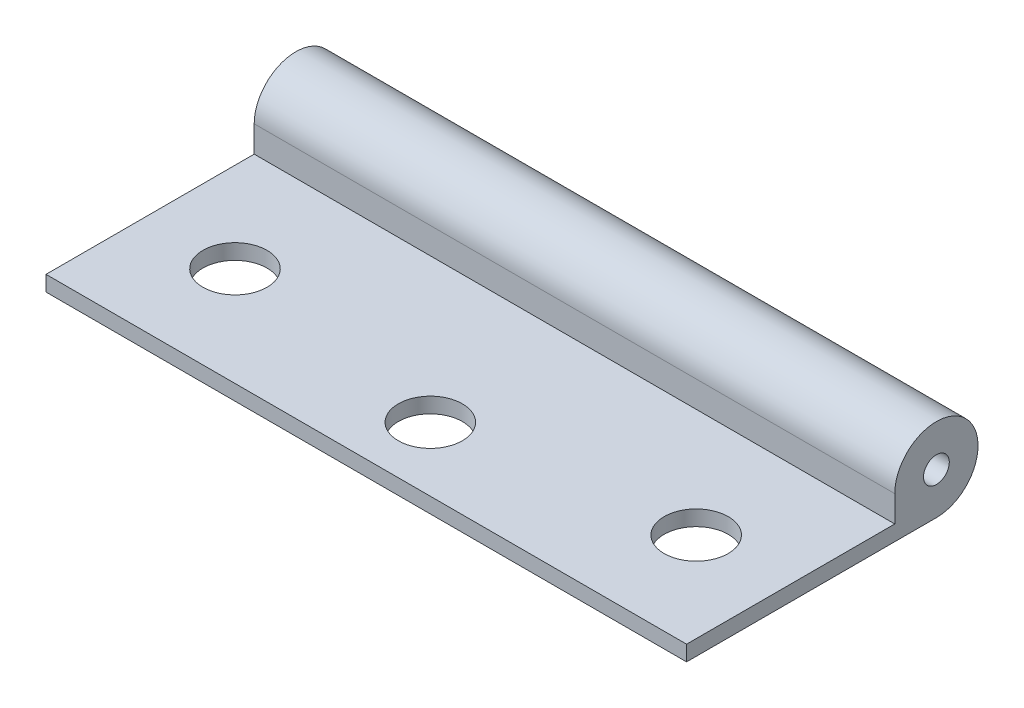
ISO-10303-21;
HEADER;
FILE_DESCRIPTION(('STEP AP214'),'2;1');
FILE_NAME('part.step','',(''),(''),'','','');
FILE_SCHEMA(('AUTOMOTIVE_DESIGN { 1 0 10303 214 1 1 1 1 }'));
ENDSEC;
DATA;
#1=APPLICATION_CONTEXT('core data for automotive mechanical design processes');
#2=APPLICATION_PROTOCOL_DEFINITION('international standard','automotive_design',2000,#1);
#3=PRODUCT_CONTEXT('',#1,'mechanical');
#4=PRODUCT('Part','Part','',(#3));
#5=PRODUCT_RELATED_PRODUCT_CATEGORY('part','',(#4));
#6=PRODUCT_DEFINITION_FORMATION('','',#4);
#7=PRODUCT_DEFINITION_CONTEXT('part definition',#1,'design');
#8=PRODUCT_DEFINITION('design','',#6,#7);
#9=PRODUCT_DEFINITION_SHAPE('','',#8);
#10=(LENGTH_UNIT() NAMED_UNIT(*) SI_UNIT(.MILLI.,.METRE.));
#11=(NAMED_UNIT(*) PLANE_ANGLE_UNIT() SI_UNIT($,.RADIAN.));
#12=(NAMED_UNIT(*) SI_UNIT($,.STERADIAN.) SOLID_ANGLE_UNIT());
#13=UNCERTAINTY_MEASURE_WITH_UNIT(LENGTH_MEASURE(1.E-05),#10,'distance_accuracy_value','');
#14=(GEOMETRIC_REPRESENTATION_CONTEXT(3) GLOBAL_UNCERTAINTY_ASSIGNED_CONTEXT((#13)) GLOBAL_UNIT_ASSIGNED_CONTEXT((#10,
#11,#12)) REPRESENTATION_CONTEXT('',''));
#15=CARTESIAN_POINT('',(0.,0.,0.));
#16=DIRECTION('',(0.,0.,1.));
#17=DIRECTION('',(1.,0.,0.));
#18=AXIS2_PLACEMENT_3D('',#15,#16,#17);
#19=CARTESIAN_POINT('',(0.,1.2,0.));
#20=DIRECTION('',(0.,1.,0.));
#21=DIRECTION('',(0.,0.,1.));
#22=AXIS2_PLACEMENT_3D('',#19,#20,#21);
#23=PLANE('',#22);
#24=CARTESIAN_POINT('',(43.,1.2,8.49999999999999));
#25=DIRECTION('',(0.,1.,0.));
#26=DIRECTION('',(0.,0.,1.));
#27=AXIS2_PLACEMENT_3D('',#24,#25,#26);
#28=CIRCLE('',#27,2.5);
#29=CARTESIAN_POINT('',(43.,1.2,11.));
#30=VERTEX_POINT('',#29);
#31=EDGE_CURVE('E109',#30,#30,#28,.T.);
#32=ORIENTED_EDGE('',*,*,#31,.F.);
#33=EDGE_LOOP('',(#32));
#34=FACE_BOUND('',#33,.T.);
#35=DIRECTION('',(0.,0.,1.));
#36=VECTOR('',#35,1.);
#37=CARTESIAN_POINT('',(0.,1.2,0.));
#38=LINE('',#37,#36);
#39=CARTESIAN_POINT('',(0.,1.2,0.));
#40=VERTEX_POINT('',#39);
#41=CARTESIAN_POINT('',(0.,1.2,16.25));
#42=VERTEX_POINT('',#41);
#43=EDGE_CURVE('E86',#40,#42,#38,.T.);
#44=ORIENTED_EDGE('',*,*,#43,.T.);
#45=DIRECTION('',(1.,0.,0.));
#46=VECTOR('',#45,1.);
#47=CARTESIAN_POINT('',(0.,1.2,16.25));
#48=LINE('',#47,#46);
#49=CARTESIAN_POINT('',(50.,1.2,16.25));
#50=VERTEX_POINT('',#49);
#51=EDGE_CURVE('E81',#42,#50,#48,.T.);
#52=ORIENTED_EDGE('',*,*,#51,.T.);
#53=DIRECTION('',(0.,0.,-1.));
#54=VECTOR('',#53,1.);
#55=CARTESIAN_POINT('',(50.,1.2,0.));
#56=LINE('',#55,#54);
#57=CARTESIAN_POINT('',(50.,1.2,0.));
#58=VERTEX_POINT('',#57);
#59=EDGE_CURVE('E85',#50,#58,#56,.T.);
#60=ORIENTED_EDGE('',*,*,#59,.T.);
#61=DIRECTION('',(-1.,0.,0.));
#62=VECTOR('',#61,1.);
#63=CARTESIAN_POINT('',(0.,1.2,0.));
#64=LINE('',#63,#62);
#65=EDGE_CURVE('E51',#58,#40,#64,.T.);
#66=ORIENTED_EDGE('',*,*,#65,.T.);
#67=EDGE_LOOP('',(#44,#52,#60,#66));
#68=FACE_BOUND('',#67,.T.);
#69=CARTESIAN_POINT('',(7.,1.2,8.5));
#70=DIRECTION('',(0.,1.,0.));
#71=DIRECTION('',(0.,0.,1.));
#72=AXIS2_PLACEMENT_3D('',#69,#70,#71);
#73=CIRCLE('',#72,2.5);
#74=CARTESIAN_POINT('',(7.,1.2,11.));
#75=VERTEX_POINT('',#74);
#76=EDGE_CURVE('E102',#75,#75,#73,.T.);
#77=ORIENTED_EDGE('',*,*,#76,.F.);
#78=EDGE_LOOP('',(#77));
#79=FACE_BOUND('',#78,.T.);
#80=CARTESIAN_POINT('',(25.,1.2,11.25));
#81=DIRECTION('',(0.,1.,0.));
#82=DIRECTION('',(0.,0.,1.));
#83=AXIS2_PLACEMENT_3D('',#80,#81,#82);
#84=CIRCLE('',#83,2.5);
#85=CARTESIAN_POINT('',(25.,1.2,13.75));
#86=VERTEX_POINT('',#85);
#87=EDGE_CURVE('E115',#86,#86,#84,.T.);
#88=ORIENTED_EDGE('',*,*,#87,.F.);
#89=EDGE_LOOP('',(#88));
#90=FACE_BOUND('',#89,.T.);
#91=ADVANCED_FACE('F34',(#34,#68,#79,#90),#23,.T.);
#92=CARTESIAN_POINT('',(0.,0.,0.));
#93=DIRECTION('',(0.,1.,0.));
#94=DIRECTION('',(0.,0.,1.));
#95=AXIS2_PLACEMENT_3D('',#92,#93,#94);
#96=PLANE('',#95);
#97=DIRECTION('',(0.,0.,1.));
#98=VECTOR('',#97,1.);
#99=CARTESIAN_POINT('',(0.,0.,0.));
#100=LINE('',#99,#98);
#101=CARTESIAN_POINT('',(0.,0.,-3.25));
#102=VERTEX_POINT('',#101);
#103=CARTESIAN_POINT('',(0.,0.,16.25));
#104=VERTEX_POINT('',#103);
#105=EDGE_CURVE('E99',#102,#104,#100,.T.);
#106=ORIENTED_EDGE('',*,*,#105,.F.);
#107=DIRECTION('',(-1.,0.,0.));
#108=VECTOR('',#107,1.);
#109=CARTESIAN_POINT('',(59.1923881554251,0.,-3.25000000000001));
#110=LINE('',#109,#108);
#111=CARTESIAN_POINT('',(50.,0.,-3.25000000000001));
#112=VERTEX_POINT('',#111);
#113=EDGE_CURVE('E126',#112,#102,#110,.T.);
#114=ORIENTED_EDGE('',*,*,#113,.F.);
#115=DIRECTION('',(0.,0.,-1.));
#116=VECTOR('',#115,1.);
#117=CARTESIAN_POINT('',(50.,0.,0.));
#118=LINE('',#117,#116);
#119=CARTESIAN_POINT('',(50.,0.,16.25));
#120=VERTEX_POINT('',#119);
#121=EDGE_CURVE('E104',#120,#112,#118,.T.);
#122=ORIENTED_EDGE('',*,*,#121,.F.);
#123=DIRECTION('',(1.,0.,0.));
#124=VECTOR('',#123,1.);
#125=CARTESIAN_POINT('',(0.,0.,16.25));
#126=LINE('',#125,#124);
#127=EDGE_CURVE('E63',#104,#120,#126,.T.);
#128=ORIENTED_EDGE('',*,*,#127,.F.);
#129=EDGE_LOOP('',(#106,#114,#122,#128));
#130=FACE_BOUND('',#129,.T.);
#131=CARTESIAN_POINT('',(7.,0.,8.5));
#132=DIRECTION('',(0.,1.,0.));
#133=DIRECTION('',(0.,0.,1.));
#134=AXIS2_PLACEMENT_3D('',#131,#132,#133);
#135=CIRCLE('',#134,2.5);
#136=CARTESIAN_POINT('',(7.,0.,11.));
#137=VERTEX_POINT('',#136);
#138=EDGE_CURVE('E106',#137,#137,#135,.T.);
#139=ORIENTED_EDGE('',*,*,#138,.T.);
#140=EDGE_LOOP('',(#139));
#141=FACE_BOUND('',#140,.T.);
#142=CARTESIAN_POINT('',(43.,0.,8.49999999999999));
#143=DIRECTION('',(0.,1.,0.));
#144=DIRECTION('',(0.,0.,1.));
#145=AXIS2_PLACEMENT_3D('',#142,#143,#144);
#146=CIRCLE('',#145,2.5);
#147=CARTESIAN_POINT('',(43.,0.,11.));
#148=VERTEX_POINT('',#147);
#149=EDGE_CURVE('E112',#148,#148,#146,.T.);
#150=ORIENTED_EDGE('',*,*,#149,.T.);
#151=EDGE_LOOP('',(#150));
#152=FACE_BOUND('',#151,.T.);
#153=CARTESIAN_POINT('',(25.,0.,11.25));
#154=DIRECTION('',(0.,1.,0.));
#155=DIRECTION('',(0.,0.,1.));
#156=AXIS2_PLACEMENT_3D('',#153,#154,#155);
#157=CIRCLE('',#156,2.5);
#158=CARTESIAN_POINT('',(25.,0.,13.75));
#159=VERTEX_POINT('',#158);
#160=EDGE_CURVE('E118',#159,#159,#157,.T.);
#161=ORIENTED_EDGE('',*,*,#160,.T.);
#162=EDGE_LOOP('',(#161));
#163=FACE_BOUND('',#162,.T.);
#164=ADVANCED_FACE('F147',(#130,#141,#152,#163),#96,.F.);
#165=CARTESIAN_POINT('',(0.,1.2,0.));
#166=DIRECTION('',(1.,0.,0.));
#167=DIRECTION('',(0.,0.,-1.));
#168=AXIS2_PLACEMENT_3D('',#165,#166,#167);
#169=PLANE('',#168);
#170=ORIENTED_EDGE('',*,*,#105,.T.);
#171=DIRECTION('',(0.,-1.,0.));
#172=VECTOR('',#171,1.);
#173=CARTESIAN_POINT('',(0.,1.2,16.25));
#174=LINE('',#173,#172);
#175=EDGE_CURVE('E11',#42,#104,#174,.T.);
#176=ORIENTED_EDGE('',*,*,#175,.F.);
#177=ORIENTED_EDGE('',*,*,#43,.F.);
#178=DIRECTION('',(0.,1.,0.));
#179=VECTOR('',#178,1.);
#180=CARTESIAN_POINT('',(0.,0.,0.));
#181=LINE('',#180,#179);
#182=CARTESIAN_POINT('',(0.,3.25,0.));
#183=VERTEX_POINT('',#182);
#184=EDGE_CURVE('E130',#40,#183,#181,.T.);
#185=ORIENTED_EDGE('',*,*,#184,.T.);
#186=CARTESIAN_POINT('',(0.,3.25,-3.25));
#187=DIRECTION('',(-1.,0.,0.));
#188=DIRECTION('',(0.,0.,1.));
#189=AXIS2_PLACEMENT_3D('',#186,#187,#188);
#190=CIRCLE('',#189,3.25);
#191=EDGE_CURVE('E135',#183,#102,#190,.T.);
#192=ORIENTED_EDGE('',*,*,#191,.T.);
#193=EDGE_LOOP('',(#170,#176,#177,#185,#192));
#194=FACE_BOUND('',#193,.T.);
#195=CARTESIAN_POINT('',(0.,3.25,-3.25));
#196=DIRECTION('',(-1.,0.,0.));
#197=DIRECTION('',(0.,0.,1.));
#198=AXIS2_PLACEMENT_3D('',#195,#196,#197);
#199=CIRCLE('',#198,1.00565376597662);
#200=CARTESIAN_POINT('',(0.,3.25,-2.24434623402338));
#201=VERTEX_POINT('',#200);
#202=EDGE_CURVE('E138',#201,#201,#199,.T.);
#203=ORIENTED_EDGE('',*,*,#202,.F.);
#204=EDGE_LOOP('',(#203));
#205=FACE_BOUND('',#204,.T.);
#206=ADVANCED_FACE('F36',(#194,#205),#169,.F.);
#207=CARTESIAN_POINT('',(0.,1.2,16.25));
#208=DIRECTION('',(0.,0.,-1.));
#209=DIRECTION('',(-1.,0.,0.));
#210=AXIS2_PLACEMENT_3D('',#207,#208,#209);
#211=PLANE('',#210);
#212=ORIENTED_EDGE('',*,*,#127,.T.);
#213=DIRECTION('',(0.,-1.,0.));
#214=VECTOR('',#213,1.);
#215=CARTESIAN_POINT('',(50.,1.2,16.25));
#216=LINE('',#215,#214);
#217=EDGE_CURVE('E43',#50,#120,#216,.T.);
#218=ORIENTED_EDGE('',*,*,#217,.F.);
#219=ORIENTED_EDGE('',*,*,#51,.F.);
#220=ORIENTED_EDGE('',*,*,#175,.T.);
#221=EDGE_LOOP('',(#212,#218,#219,#220));
#222=FACE_BOUND('',#221,.T.);
#223=ADVANCED_FACE('F91',(#222),#211,.F.);
#224=CARTESIAN_POINT('',(50.,1.2,0.));
#225=DIRECTION('',(-1.,0.,0.));
#226=DIRECTION('',(0.,0.,1.));
#227=AXIS2_PLACEMENT_3D('',#224,#225,#226);
#228=PLANE('',#227);
#229=ORIENTED_EDGE('',*,*,#121,.T.);
#230=CARTESIAN_POINT('',(50.,3.25,-3.25000000000001));
#231=DIRECTION('',(-1.,0.,0.));
#232=DIRECTION('',(0.,0.,1.));
#233=AXIS2_PLACEMENT_3D('',#230,#231,#232);
#234=CIRCLE('',#233,3.25);
#235=CARTESIAN_POINT('',(50.,3.25,0.));
#236=VERTEX_POINT('',#235);
#237=EDGE_CURVE('E72',#112,#236,#234,.F.);
#238=ORIENTED_EDGE('',*,*,#237,.T.);
#239=DIRECTION('',(0.,-1.,0.));
#240=VECTOR('',#239,1.);
#241=CARTESIAN_POINT('',(50.,0.,0.));
#242=LINE('',#241,#240);
#243=EDGE_CURVE('E94',#236,#58,#242,.T.);
#244=ORIENTED_EDGE('',*,*,#243,.T.);
#245=ORIENTED_EDGE('',*,*,#59,.F.);
#246=ORIENTED_EDGE('',*,*,#217,.T.);
#247=EDGE_LOOP('',(#229,#238,#244,#245,#246));
#248=FACE_BOUND('',#247,.T.);
#249=CARTESIAN_POINT('',(50.,3.25,-3.25000000000001));
#250=DIRECTION('',(-1.,0.,0.));
#251=DIRECTION('',(0.,0.,1.));
#252=AXIS2_PLACEMENT_3D('',#249,#250,#251);
#253=CIRCLE('',#252,1.00565376597662);
#254=CARTESIAN_POINT('',(50.,3.25,-2.24434623402338));
#255=VERTEX_POINT('',#254);
#256=EDGE_CURVE('E121',#255,#255,#253,.F.);
#257=ORIENTED_EDGE('',*,*,#256,.F.);
#258=EDGE_LOOP('',(#257));
#259=FACE_BOUND('',#258,.T.);
#260=ADVANCED_FACE('F92',(#248,#259),#228,.F.);
#261=CARTESIAN_POINT('',(7.,1.2,8.5));
#262=DIRECTION('',(0.,-1.,0.));
#263=DIRECTION('',(0.,0.,-1.));
#264=AXIS2_PLACEMENT_3D('',#261,#262,#263);
#265=CYLINDRICAL_SURFACE('',#264,2.5);
#266=ORIENTED_EDGE('',*,*,#76,.T.);
#267=EDGE_LOOP('',(#266));
#268=FACE_BOUND('',#267,.T.);
#269=ORIENTED_EDGE('',*,*,#138,.F.);
#270=EDGE_LOOP('',(#269));
#271=FACE_BOUND('',#270,.T.);
#272=ADVANCED_FACE('F161',(#268,#271),#265,.F.);
#273=CARTESIAN_POINT('',(43.,1.2,8.49999999999999));
#274=DIRECTION('',(0.,-1.,0.));
#275=DIRECTION('',(0.,0.,-1.));
#276=AXIS2_PLACEMENT_3D('',#273,#274,#275);
#277=CYLINDRICAL_SURFACE('',#276,2.5);
#278=ORIENTED_EDGE('',*,*,#31,.T.);
#279=EDGE_LOOP('',(#278));
#280=FACE_BOUND('',#279,.T.);
#281=ORIENTED_EDGE('',*,*,#149,.F.);
#282=EDGE_LOOP('',(#281));
#283=FACE_BOUND('',#282,.T.);
#284=ADVANCED_FACE('F168',(#280,#283),#277,.F.);
#285=CARTESIAN_POINT('',(25.,1.2,11.25));
#286=DIRECTION('',(0.,-1.,0.));
#287=DIRECTION('',(0.,0.,-1.));
#288=AXIS2_PLACEMENT_3D('',#285,#286,#287);
#289=CYLINDRICAL_SURFACE('',#288,2.5);
#290=ORIENTED_EDGE('',*,*,#87,.T.);
#291=EDGE_LOOP('',(#290));
#292=FACE_BOUND('',#291,.T.);
#293=ORIENTED_EDGE('',*,*,#160,.F.);
#294=EDGE_LOOP('',(#293));
#295=FACE_BOUND('',#294,.T.);
#296=ADVANCED_FACE('F173',(#292,#295),#289,.F.);
#297=CARTESIAN_POINT('',(59.1923881554251,0.,0.));
#298=DIRECTION('',(0.,0.,1.));
#299=DIRECTION('',(1.,0.,0.));
#300=AXIS2_PLACEMENT_3D('',#297,#298,#299);
#301=PLANE('',#300);
#302=ORIENTED_EDGE('',*,*,#184,.F.);
#303=ORIENTED_EDGE('',*,*,#65,.F.);
#304=ORIENTED_EDGE('',*,*,#243,.F.);
#305=DIRECTION('',(-1.,0.,0.));
#306=VECTOR('',#305,1.);
#307=CARTESIAN_POINT('',(59.1923881554251,3.25,0.));
#308=LINE('',#307,#306);
#309=EDGE_CURVE('E129',#236,#183,#308,.T.);
#310=ORIENTED_EDGE('',*,*,#309,.T.);
#311=EDGE_LOOP('',(#302,#303,#304,#310));
#312=FACE_BOUND('',#311,.T.);
#313=ADVANCED_FACE('F185',(#312),#301,.T.);
#314=CARTESIAN_POINT('',(59.1923881554251,3.25,-3.25000000000001));
#315=DIRECTION('',(-1.,0.,0.));
#316=DIRECTION('',(0.,0.,1.));
#317=AXIS2_PLACEMENT_3D('',#314,#315,#316);
#318=CYLINDRICAL_SURFACE('',#317,3.25);
#319=ORIENTED_EDGE('',*,*,#237,.F.);
#320=ORIENTED_EDGE('',*,*,#113,.T.);
#321=ORIENTED_EDGE('',*,*,#191,.F.);
#322=ORIENTED_EDGE('',*,*,#309,.F.);
#323=EDGE_LOOP('',(#319,#320,#321,#322));
#324=FACE_BOUND('',#323,.T.);
#325=ADVANCED_FACE('F191',(#324),#318,.T.);
#326=CARTESIAN_POINT('',(59.1923881554251,3.25,-3.25000000000001));
#327=DIRECTION('',(-1.,0.,0.));
#328=DIRECTION('',(0.,0.,1.));
#329=AXIS2_PLACEMENT_3D('',#326,#327,#328);
#330=CYLINDRICAL_SURFACE('',#329,1.00565376597662);
#331=ORIENTED_EDGE('',*,*,#256,.T.);
#332=EDGE_LOOP('',(#331));
#333=FACE_BOUND('',#332,.T.);
#334=ORIENTED_EDGE('',*,*,#202,.T.);
#335=EDGE_LOOP('',(#334));
#336=FACE_BOUND('',#335,.T.);
#337=ADVANCED_FACE('F144',(#333,#336),#330,.F.);
#338=CLOSED_SHELL('',(#91,#164,#206,#223,#260,#272,#284,#296,#313,#325,#337));
#339=MANIFOLD_SOLID_BREP('B2',#338);
#340=ADVANCED_BREP_SHAPE_REPRESENTATION('',(#18,#339),#14);
#341=SHAPE_DEFINITION_REPRESENTATION(#9,#340);
ENDSEC;
END-ISO-10303-21;
